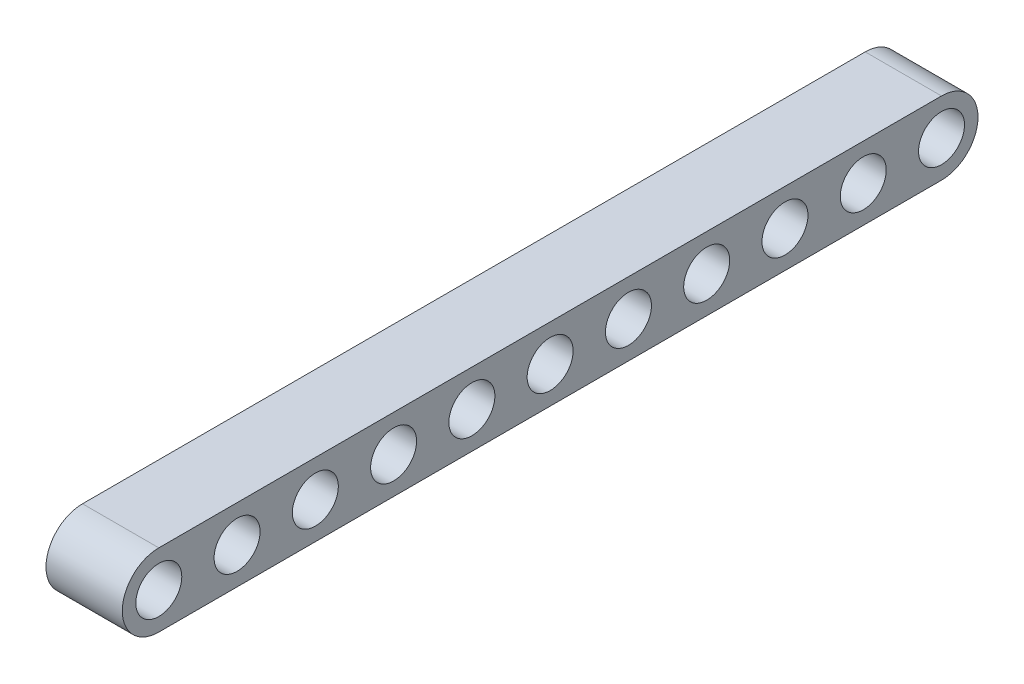
ISO-10303-21;
HEADER;
FILE_DESCRIPTION(('STEP AP214'),'2;1');
FILE_NAME('part.step','',(''),(''),'','','');
FILE_SCHEMA(('AUTOMOTIVE_DESIGN { 1 0 10303 214 1 1 1 1 }'));
ENDSEC;
DATA;
#1=APPLICATION_CONTEXT('core data for automotive mechanical design processes');
#2=APPLICATION_PROTOCOL_DEFINITION('international standard','automotive_design',2000,#1);
#3=PRODUCT_CONTEXT('',#1,'mechanical');
#4=PRODUCT('Part','Part','',(#3));
#5=PRODUCT_RELATED_PRODUCT_CATEGORY('part','',(#4));
#6=PRODUCT_DEFINITION_FORMATION('','',#4);
#7=PRODUCT_DEFINITION_CONTEXT('part definition',#1,'design');
#8=PRODUCT_DEFINITION('design','',#6,#7);
#9=PRODUCT_DEFINITION_SHAPE('','',#8);
#10=(LENGTH_UNIT() NAMED_UNIT(*) SI_UNIT(.MILLI.,.METRE.));
#11=(NAMED_UNIT(*) PLANE_ANGLE_UNIT() SI_UNIT($,.RADIAN.));
#12=(NAMED_UNIT(*) SI_UNIT($,.STERADIAN.) SOLID_ANGLE_UNIT());
#13=UNCERTAINTY_MEASURE_WITH_UNIT(LENGTH_MEASURE(1.E-05),#10,'distance_accuracy_value','');
#14=(GEOMETRIC_REPRESENTATION_CONTEXT(3) GLOBAL_UNCERTAINTY_ASSIGNED_CONTEXT((#13)) GLOBAL_UNIT_ASSIGNED_CONTEXT((#10,
#11,#12)) REPRESENTATION_CONTEXT('',''));
#15=CARTESIAN_POINT('',(0.,0.,0.));
#16=DIRECTION('',(0.,0.,1.));
#17=DIRECTION('',(1.,0.,0.));
#18=AXIS2_PLACEMENT_3D('',#15,#16,#17);
#19=CARTESIAN_POINT('',(7.8,0.,-40.));
#20=DIRECTION('',(1.,0.,0.));
#21=DIRECTION('',(0.,0.,-1.));
#22=AXIS2_PLACEMENT_3D('',#19,#20,#21);
#23=PLANE('',#22);
#24=CARTESIAN_POINT('',(7.8,0.,-32.));
#25=DIRECTION('',(1.,0.,0.));
#26=DIRECTION('',(0.,0.,-1.));
#27=AXIS2_PLACEMENT_3D('',#24,#25,#26);
#28=CIRCLE('',#27,2.35);
#29=CARTESIAN_POINT('',(7.8,0.,-34.35));
#30=VERTEX_POINT('',#29);
#31=EDGE_CURVE('E163',#30,#30,#28,.T.);
#32=ORIENTED_EDGE('',*,*,#31,.F.);
#33=EDGE_LOOP('',(#32));
#34=FACE_BOUND('',#33,.T.);
#35=CARTESIAN_POINT('',(7.8,0.,-16.));
#36=DIRECTION('',(1.,0.,0.));
#37=DIRECTION('',(0.,0.,-1.));
#38=AXIS2_PLACEMENT_3D('',#35,#36,#37);
#39=CIRCLE('',#38,2.35);
#40=CARTESIAN_POINT('',(7.8,0.,-18.35));
#41=VERTEX_POINT('',#40);
#42=EDGE_CURVE('E151',#41,#41,#39,.T.);
#43=ORIENTED_EDGE('',*,*,#42,.F.);
#44=EDGE_LOOP('',(#43));
#45=FACE_BOUND('',#44,.T.);
#46=CARTESIAN_POINT('',(7.8,0.,0.));
#47=DIRECTION('',(1.,0.,0.));
#48=DIRECTION('',(0.,0.,-1.));
#49=AXIS2_PLACEMENT_3D('',#46,#47,#48);
#50=CIRCLE('',#49,2.35);
#51=CARTESIAN_POINT('',(7.8,0.,-2.34999999999998));
#52=VERTEX_POINT('',#51);
#53=EDGE_CURVE('E139',#52,#52,#50,.T.);
#54=ORIENTED_EDGE('',*,*,#53,.F.);
#55=EDGE_LOOP('',(#54));
#56=FACE_BOUND('',#55,.T.);
#57=CARTESIAN_POINT('',(7.8,0.,16.));
#58=DIRECTION('',(1.,0.,0.));
#59=DIRECTION('',(0.,0.,-1.));
#60=AXIS2_PLACEMENT_3D('',#57,#58,#59);
#61=CIRCLE('',#60,2.35);
#62=CARTESIAN_POINT('',(7.8,0.,13.65));
#63=VERTEX_POINT('',#62);
#64=EDGE_CURVE('E127',#63,#63,#61,.T.);
#65=ORIENTED_EDGE('',*,*,#64,.F.);
#66=EDGE_LOOP('',(#65));
#67=FACE_BOUND('',#66,.T.);
#68=CARTESIAN_POINT('',(7.8,0.,32.));
#69=DIRECTION('',(1.,0.,0.));
#70=DIRECTION('',(0.,0.,-1.));
#71=AXIS2_PLACEMENT_3D('',#68,#69,#70);
#72=CIRCLE('',#71,2.35);
#73=CARTESIAN_POINT('',(7.8,0.,29.65));
#74=VERTEX_POINT('',#73);
#75=EDGE_CURVE('E115',#74,#74,#72,.T.);
#76=ORIENTED_EDGE('',*,*,#75,.F.);
#77=EDGE_LOOP('',(#76));
#78=FACE_BOUND('',#77,.T.);
#79=CARTESIAN_POINT('',(7.8,0.,-40.));
#80=DIRECTION('',(1.,0.,0.));
#81=DIRECTION('',(0.,0.,-1.));
#82=AXIS2_PLACEMENT_3D('',#79,#80,#81);
#83=CIRCLE('',#82,3.73);
#84=CARTESIAN_POINT('',(7.8,-3.73,-40.));
#85=VERTEX_POINT('',#84);
#86=CARTESIAN_POINT('',(7.8,3.73,-40.));
#87=VERTEX_POINT('',#86);
#88=EDGE_CURVE('E85',#85,#87,#83,.T.);
#89=ORIENTED_EDGE('',*,*,#88,.T.);
#90=DIRECTION('',(0.,0.,1.));
#91=VECTOR('',#90,1.);
#92=CARTESIAN_POINT('',(7.8,3.73,40.));
#93=LINE('',#92,#91);
#94=CARTESIAN_POINT('',(7.8,3.73,40.));
#95=VERTEX_POINT('',#94);
#96=EDGE_CURVE('E80',#87,#95,#93,.T.);
#97=ORIENTED_EDGE('',*,*,#96,.T.);
#98=CARTESIAN_POINT('',(7.8,0.,40.));
#99=DIRECTION('',(1.,0.,0.));
#100=DIRECTION('',(0.,0.,-1.));
#101=AXIS2_PLACEMENT_3D('',#98,#99,#100);
#102=CIRCLE('',#101,3.73);
#103=CARTESIAN_POINT('',(7.8,-3.73,40.));
#104=VERTEX_POINT('',#103);
#105=EDGE_CURVE('E83',#95,#104,#102,.T.);
#106=ORIENTED_EDGE('',*,*,#105,.T.);
#107=DIRECTION('',(0.,0.,-1.));
#108=VECTOR('',#107,1.);
#109=CARTESIAN_POINT('',(7.8,-3.73,40.));
#110=LINE('',#109,#108);
#111=EDGE_CURVE('E50',#104,#85,#110,.T.);
#112=ORIENTED_EDGE('',*,*,#111,.T.);
#113=EDGE_LOOP('',(#89,#97,#106,#112));
#114=FACE_BOUND('',#113,.T.);
#115=CARTESIAN_POINT('',(7.8,0.,40.));
#116=DIRECTION('',(1.,0.,0.));
#117=DIRECTION('',(0.,0.,-1.));
#118=AXIS2_PLACEMENT_3D('',#115,#116,#117);
#119=CIRCLE('',#118,2.35);
#120=CARTESIAN_POINT('',(7.8,0.,37.65));
#121=VERTEX_POINT('',#120);
#122=EDGE_CURVE('E100',#121,#121,#119,.T.);
#123=ORIENTED_EDGE('',*,*,#122,.F.);
#124=EDGE_LOOP('',(#123));
#125=FACE_BOUND('',#124,.T.);
#126=CARTESIAN_POINT('',(7.8,0.,24.));
#127=DIRECTION('',(1.,0.,0.));
#128=DIRECTION('',(0.,0.,-1.));
#129=AXIS2_PLACEMENT_3D('',#126,#127,#128);
#130=CIRCLE('',#129,2.35);
#131=CARTESIAN_POINT('',(7.8,0.,21.65));
#132=VERTEX_POINT('',#131);
#133=EDGE_CURVE('E121',#132,#132,#130,.T.);
#134=ORIENTED_EDGE('',*,*,#133,.F.);
#135=EDGE_LOOP('',(#134));
#136=FACE_BOUND('',#135,.T.);
#137=CARTESIAN_POINT('',(7.8,0.,8.00000000000001));
#138=DIRECTION('',(1.,0.,0.));
#139=DIRECTION('',(0.,0.,-1.));
#140=AXIS2_PLACEMENT_3D('',#137,#138,#139);
#141=CIRCLE('',#140,2.35);
#142=CARTESIAN_POINT('',(7.8,0.,5.65000000000002));
#143=VERTEX_POINT('',#142);
#144=EDGE_CURVE('E133',#143,#143,#141,.T.);
#145=ORIENTED_EDGE('',*,*,#144,.F.);
#146=EDGE_LOOP('',(#145));
#147=FACE_BOUND('',#146,.T.);
#148=CARTESIAN_POINT('',(7.8,0.,-7.99999999999999));
#149=DIRECTION('',(1.,0.,0.));
#150=DIRECTION('',(0.,0.,-1.));
#151=AXIS2_PLACEMENT_3D('',#148,#149,#150);
#152=CIRCLE('',#151,2.35);
#153=CARTESIAN_POINT('',(7.8,0.,-10.35));
#154=VERTEX_POINT('',#153);
#155=EDGE_CURVE('E145',#154,#154,#152,.T.);
#156=ORIENTED_EDGE('',*,*,#155,.F.);
#157=EDGE_LOOP('',(#156));
#158=FACE_BOUND('',#157,.T.);
#159=CARTESIAN_POINT('',(7.8,0.,-24.));
#160=DIRECTION('',(1.,0.,0.));
#161=DIRECTION('',(0.,0.,-1.));
#162=AXIS2_PLACEMENT_3D('',#159,#160,#161);
#163=CIRCLE('',#162,2.35);
#164=CARTESIAN_POINT('',(7.8,0.,-26.35));
#165=VERTEX_POINT('',#164);
#166=EDGE_CURVE('E157',#165,#165,#163,.T.);
#167=ORIENTED_EDGE('',*,*,#166,.F.);
#168=EDGE_LOOP('',(#167));
#169=FACE_BOUND('',#168,.T.);
#170=CARTESIAN_POINT('',(7.8,0.,-40.));
#171=DIRECTION('',(1.,0.,0.));
#172=DIRECTION('',(0.,0.,-1.));
#173=AXIS2_PLACEMENT_3D('',#170,#171,#172);
#174=CIRCLE('',#173,2.35);
#175=CARTESIAN_POINT('',(7.8,0.,-42.35));
#176=VERTEX_POINT('',#175);
#177=EDGE_CURVE('E169',#176,#176,#174,.T.);
#178=ORIENTED_EDGE('',*,*,#177,.F.);
#179=EDGE_LOOP('',(#178));
#180=FACE_BOUND('',#179,.T.);
#181=ADVANCED_FACE('F33',(#34,#45,#56,#67,#78,#114,#125,#136,#147,#158,#169,#180),#23,.T.);
#182=CARTESIAN_POINT('',(0.,0.,-40.));
#183=DIRECTION('',(1.,0.,0.));
#184=DIRECTION('',(0.,0.,-1.));
#185=AXIS2_PLACEMENT_3D('',#182,#183,#184);
#186=PLANE('',#185);
#187=CARTESIAN_POINT('',(0.,0.,-40.));
#188=DIRECTION('',(1.,0.,0.));
#189=DIRECTION('',(0.,0.,-1.));
#190=AXIS2_PLACEMENT_3D('',#187,#188,#189);
#191=CIRCLE('',#190,3.73);
#192=CARTESIAN_POINT('',(0.,-3.73,-40.));
#193=VERTEX_POINT('',#192);
#194=CARTESIAN_POINT('',(0.,3.73,-40.));
#195=VERTEX_POINT('',#194);
#196=EDGE_CURVE('E97',#193,#195,#191,.T.);
#197=ORIENTED_EDGE('',*,*,#196,.F.);
#198=DIRECTION('',(0.,0.,-1.));
#199=VECTOR('',#198,1.);
#200=CARTESIAN_POINT('',(0.,-3.73,40.));
#201=LINE('',#200,#199);
#202=CARTESIAN_POINT('',(0.,-3.73,40.));
#203=VERTEX_POINT('',#202);
#204=EDGE_CURVE('E73',#203,#193,#201,.T.);
#205=ORIENTED_EDGE('',*,*,#204,.F.);
#206=CARTESIAN_POINT('',(0.,0.,40.));
#207=DIRECTION('',(1.,0.,0.));
#208=DIRECTION('',(0.,0.,-1.));
#209=AXIS2_PLACEMENT_3D('',#206,#207,#208);
#210=CIRCLE('',#209,3.73);
#211=CARTESIAN_POINT('',(0.,3.73,40.));
#212=VERTEX_POINT('',#211);
#213=EDGE_CURVE('E67',#212,#203,#210,.T.);
#214=ORIENTED_EDGE('',*,*,#213,.F.);
#215=DIRECTION('',(0.,0.,1.));
#216=VECTOR('',#215,1.);
#217=CARTESIAN_POINT('',(0.,3.73,40.));
#218=LINE('',#217,#216);
#219=EDGE_CURVE('E89',#195,#212,#218,.T.);
#220=ORIENTED_EDGE('',*,*,#219,.F.);
#221=EDGE_LOOP('',(#197,#205,#214,#220));
#222=FACE_BOUND('',#221,.T.);
#223=CARTESIAN_POINT('',(0.,0.,40.));
#224=DIRECTION('',(1.,0.,0.));
#225=DIRECTION('',(0.,0.,-1.));
#226=AXIS2_PLACEMENT_3D('',#223,#224,#225);
#227=CIRCLE('',#226,2.35);
#228=CARTESIAN_POINT('',(0.,0.,37.65));
#229=VERTEX_POINT('',#228);
#230=EDGE_CURVE('E112',#229,#229,#227,.T.);
#231=ORIENTED_EDGE('',*,*,#230,.T.);
#232=EDGE_LOOP('',(#231));
#233=FACE_BOUND('',#232,.T.);
#234=CARTESIAN_POINT('',(0.,0.,32.));
#235=DIRECTION('',(1.,0.,0.));
#236=DIRECTION('',(0.,0.,-1.));
#237=AXIS2_PLACEMENT_3D('',#234,#235,#236);
#238=CIRCLE('',#237,2.35);
#239=CARTESIAN_POINT('',(0.,0.,29.65));
#240=VERTEX_POINT('',#239);
#241=EDGE_CURVE('E118',#240,#240,#238,.T.);
#242=ORIENTED_EDGE('',*,*,#241,.T.);
#243=EDGE_LOOP('',(#242));
#244=FACE_BOUND('',#243,.T.);
#245=CARTESIAN_POINT('',(0.,0.,24.));
#246=DIRECTION('',(1.,0.,0.));
#247=DIRECTION('',(0.,0.,-1.));
#248=AXIS2_PLACEMENT_3D('',#245,#246,#247);
#249=CIRCLE('',#248,2.35);
#250=CARTESIAN_POINT('',(0.,0.,21.65));
#251=VERTEX_POINT('',#250);
#252=EDGE_CURVE('E124',#251,#251,#249,.T.);
#253=ORIENTED_EDGE('',*,*,#252,.T.);
#254=EDGE_LOOP('',(#253));
#255=FACE_BOUND('',#254,.T.);
#256=CARTESIAN_POINT('',(0.,0.,16.));
#257=DIRECTION('',(1.,0.,0.));
#258=DIRECTION('',(0.,0.,-1.));
#259=AXIS2_PLACEMENT_3D('',#256,#257,#258);
#260=CIRCLE('',#259,2.35);
#261=CARTESIAN_POINT('',(0.,0.,13.65));
#262=VERTEX_POINT('',#261);
#263=EDGE_CURVE('E130',#262,#262,#260,.T.);
#264=ORIENTED_EDGE('',*,*,#263,.T.);
#265=EDGE_LOOP('',(#264));
#266=FACE_BOUND('',#265,.T.);
#267=CARTESIAN_POINT('',(0.,0.,8.00000000000001));
#268=DIRECTION('',(1.,0.,0.));
#269=DIRECTION('',(0.,0.,-1.));
#270=AXIS2_PLACEMENT_3D('',#267,#268,#269);
#271=CIRCLE('',#270,2.35);
#272=CARTESIAN_POINT('',(0.,0.,5.65000000000002));
#273=VERTEX_POINT('',#272);
#274=EDGE_CURVE('E136',#273,#273,#271,.T.);
#275=ORIENTED_EDGE('',*,*,#274,.T.);
#276=EDGE_LOOP('',(#275));
#277=FACE_BOUND('',#276,.T.);
#278=CARTESIAN_POINT('',(0.,0.,0.));
#279=DIRECTION('',(1.,0.,0.));
#280=DIRECTION('',(0.,0.,-1.));
#281=AXIS2_PLACEMENT_3D('',#278,#279,#280);
#282=CIRCLE('',#281,2.35);
#283=CARTESIAN_POINT('',(0.,0.,-2.34999999999998));
#284=VERTEX_POINT('',#283);
#285=EDGE_CURVE('E142',#284,#284,#282,.T.);
#286=ORIENTED_EDGE('',*,*,#285,.T.);
#287=EDGE_LOOP('',(#286));
#288=FACE_BOUND('',#287,.T.);
#289=CARTESIAN_POINT('',(0.,0.,-7.99999999999999));
#290=DIRECTION('',(1.,0.,0.));
#291=DIRECTION('',(0.,0.,-1.));
#292=AXIS2_PLACEMENT_3D('',#289,#290,#291);
#293=CIRCLE('',#292,2.35);
#294=CARTESIAN_POINT('',(0.,0.,-10.35));
#295=VERTEX_POINT('',#294);
#296=EDGE_CURVE('E148',#295,#295,#293,.T.);
#297=ORIENTED_EDGE('',*,*,#296,.T.);
#298=EDGE_LOOP('',(#297));
#299=FACE_BOUND('',#298,.T.);
#300=CARTESIAN_POINT('',(0.,0.,-16.));
#301=DIRECTION('',(1.,0.,0.));
#302=DIRECTION('',(0.,0.,-1.));
#303=AXIS2_PLACEMENT_3D('',#300,#301,#302);
#304=CIRCLE('',#303,2.35);
#305=CARTESIAN_POINT('',(0.,0.,-18.35));
#306=VERTEX_POINT('',#305);
#307=EDGE_CURVE('E154',#306,#306,#304,.T.);
#308=ORIENTED_EDGE('',*,*,#307,.T.);
#309=EDGE_LOOP('',(#308));
#310=FACE_BOUND('',#309,.T.);
#311=CARTESIAN_POINT('',(0.,0.,-24.));
#312=DIRECTION('',(1.,0.,0.));
#313=DIRECTION('',(0.,0.,-1.));
#314=AXIS2_PLACEMENT_3D('',#311,#312,#313);
#315=CIRCLE('',#314,2.35);
#316=CARTESIAN_POINT('',(0.,0.,-26.35));
#317=VERTEX_POINT('',#316);
#318=EDGE_CURVE('E160',#317,#317,#315,.T.);
#319=ORIENTED_EDGE('',*,*,#318,.T.);
#320=EDGE_LOOP('',(#319));
#321=FACE_BOUND('',#320,.T.);
#322=CARTESIAN_POINT('',(0.,0.,-32.));
#323=DIRECTION('',(1.,0.,0.));
#324=DIRECTION('',(0.,0.,-1.));
#325=AXIS2_PLACEMENT_3D('',#322,#323,#324);
#326=CIRCLE('',#325,2.35);
#327=CARTESIAN_POINT('',(0.,0.,-34.35));
#328=VERTEX_POINT('',#327);
#329=EDGE_CURVE('E166',#328,#328,#326,.T.);
#330=ORIENTED_EDGE('',*,*,#329,.T.);
#331=EDGE_LOOP('',(#330));
#332=FACE_BOUND('',#331,.T.);
#333=CARTESIAN_POINT('',(0.,0.,-40.));
#334=DIRECTION('',(1.,0.,0.));
#335=DIRECTION('',(0.,0.,-1.));
#336=AXIS2_PLACEMENT_3D('',#333,#334,#335);
#337=CIRCLE('',#336,2.35);
#338=CARTESIAN_POINT('',(0.,0.,-42.35));
#339=VERTEX_POINT('',#338);
#340=EDGE_CURVE('E172',#339,#339,#337,.T.);
#341=ORIENTED_EDGE('',*,*,#340,.T.);
#342=EDGE_LOOP('',(#341));
#343=FACE_BOUND('',#342,.T.);
#344=ADVANCED_FACE('F108',(#222,#233,#244,#255,#266,#277,#288,#299,#310,#321,#332,#343),#186,.F.);
#345=CARTESIAN_POINT('',(7.8,0.,-40.));
#346=DIRECTION('',(-1.,0.,0.));
#347=DIRECTION('',(0.,0.,1.));
#348=AXIS2_PLACEMENT_3D('',#345,#346,#347);
#349=CYLINDRICAL_SURFACE('',#348,3.73);
#350=ORIENTED_EDGE('',*,*,#196,.T.);
#351=DIRECTION('',(-1.,0.,0.));
#352=VECTOR('',#351,1.);
#353=CARTESIAN_POINT('',(7.8,3.73,-40.));
#354=LINE('',#353,#352);
#355=EDGE_CURVE('E11',#87,#195,#354,.T.);
#356=ORIENTED_EDGE('',*,*,#355,.F.);
#357=ORIENTED_EDGE('',*,*,#88,.F.);
#358=DIRECTION('',(-1.,0.,0.));
#359=VECTOR('',#358,1.);
#360=CARTESIAN_POINT('',(7.8,-3.73,-40.));
#361=LINE('',#360,#359);
#362=EDGE_CURVE('E93',#85,#193,#361,.T.);
#363=ORIENTED_EDGE('',*,*,#362,.T.);
#364=EDGE_LOOP('',(#350,#356,#357,#363));
#365=FACE_BOUND('',#364,.T.);
#366=ADVANCED_FACE('F35',(#365),#349,.T.);
#367=CARTESIAN_POINT('',(7.8,3.73,40.));
#368=DIRECTION('',(0.,-1.,0.));
#369=DIRECTION('',(0.,0.,-1.));
#370=AXIS2_PLACEMENT_3D('',#367,#368,#369);
#371=PLANE('',#370);
#372=ORIENTED_EDGE('',*,*,#219,.T.);
#373=DIRECTION('',(-1.,0.,0.));
#374=VECTOR('',#373,1.);
#375=CARTESIAN_POINT('',(7.8,3.73,40.));
#376=LINE('',#375,#374);
#377=EDGE_CURVE('E42',#95,#212,#376,.T.);
#378=ORIENTED_EDGE('',*,*,#377,.F.);
#379=ORIENTED_EDGE('',*,*,#96,.F.);
#380=ORIENTED_EDGE('',*,*,#355,.T.);
#381=EDGE_LOOP('',(#372,#378,#379,#380));
#382=FACE_BOUND('',#381,.T.);
#383=ADVANCED_FACE('F88',(#382),#371,.F.);
#384=CARTESIAN_POINT('',(7.8,0.,40.));
#385=DIRECTION('',(-1.,0.,0.));
#386=DIRECTION('',(0.,0.,1.));
#387=AXIS2_PLACEMENT_3D('',#384,#385,#386);
#388=CYLINDRICAL_SURFACE('',#387,3.73);
#389=ORIENTED_EDGE('',*,*,#213,.T.);
#390=DIRECTION('',(-1.,0.,0.));
#391=VECTOR('',#390,1.);
#392=CARTESIAN_POINT('',(7.8,-3.73,40.));
#393=LINE('',#392,#391);
#394=EDGE_CURVE('E90',#104,#203,#393,.T.);
#395=ORIENTED_EDGE('',*,*,#394,.F.);
#396=ORIENTED_EDGE('',*,*,#105,.F.);
#397=ORIENTED_EDGE('',*,*,#377,.T.);
#398=EDGE_LOOP('',(#389,#395,#396,#397));
#399=FACE_BOUND('',#398,.T.);
#400=ADVANCED_FACE('F91',(#399),#388,.T.);
#401=CARTESIAN_POINT('',(7.8,-3.73,40.));
#402=DIRECTION('',(0.,1.,0.));
#403=DIRECTION('',(0.,0.,1.));
#404=AXIS2_PLACEMENT_3D('',#401,#402,#403);
#405=PLANE('',#404);
#406=ORIENTED_EDGE('',*,*,#204,.T.);
#407=ORIENTED_EDGE('',*,*,#362,.F.);
#408=ORIENTED_EDGE('',*,*,#111,.F.);
#409=ORIENTED_EDGE('',*,*,#394,.T.);
#410=EDGE_LOOP('',(#406,#407,#408,#409));
#411=FACE_BOUND('',#410,.T.);
#412=ADVANCED_FACE('F105',(#411),#405,.F.);
#413=CARTESIAN_POINT('',(7.8,0.,40.));
#414=DIRECTION('',(-1.,0.,0.));
#415=DIRECTION('',(0.,0.,1.));
#416=AXIS2_PLACEMENT_3D('',#413,#414,#415);
#417=CYLINDRICAL_SURFACE('',#416,2.35);
#418=ORIENTED_EDGE('',*,*,#122,.T.);
#419=EDGE_LOOP('',(#418));
#420=FACE_BOUND('',#419,.T.);
#421=ORIENTED_EDGE('',*,*,#230,.F.);
#422=EDGE_LOOP('',(#421));
#423=FACE_BOUND('',#422,.T.);
#424=ADVANCED_FACE('F191',(#420,#423),#417,.F.);
#425=CARTESIAN_POINT('',(7.8,0.,32.));
#426=DIRECTION('',(-1.,0.,0.));
#427=DIRECTION('',(0.,0.,1.));
#428=AXIS2_PLACEMENT_3D('',#425,#426,#427);
#429=CYLINDRICAL_SURFACE('',#428,2.35);
#430=ORIENTED_EDGE('',*,*,#75,.T.);
#431=EDGE_LOOP('',(#430));
#432=FACE_BOUND('',#431,.T.);
#433=ORIENTED_EDGE('',*,*,#241,.F.);
#434=EDGE_LOOP('',(#433));
#435=FACE_BOUND('',#434,.T.);
#436=ADVANCED_FACE('F237',(#432,#435),#429,.F.);
#437=CARTESIAN_POINT('',(7.8,0.,24.));
#438=DIRECTION('',(-1.,0.,0.));
#439=DIRECTION('',(0.,0.,1.));
#440=AXIS2_PLACEMENT_3D('',#437,#438,#439);
#441=CYLINDRICAL_SURFACE('',#440,2.35);
#442=ORIENTED_EDGE('',*,*,#133,.T.);
#443=EDGE_LOOP('',(#442));
#444=FACE_BOUND('',#443,.T.);
#445=ORIENTED_EDGE('',*,*,#252,.F.);
#446=EDGE_LOOP('',(#445));
#447=FACE_BOUND('',#446,.T.);
#448=ADVANCED_FACE('F245',(#444,#447),#441,.F.);
#449=CARTESIAN_POINT('',(7.8,0.,16.));
#450=DIRECTION('',(-1.,0.,0.));
#451=DIRECTION('',(0.,0.,1.));
#452=AXIS2_PLACEMENT_3D('',#449,#450,#451);
#453=CYLINDRICAL_SURFACE('',#452,2.35);
#454=ORIENTED_EDGE('',*,*,#64,.T.);
#455=EDGE_LOOP('',(#454));
#456=FACE_BOUND('',#455,.T.);
#457=ORIENTED_EDGE('',*,*,#263,.F.);
#458=EDGE_LOOP('',(#457));
#459=FACE_BOUND('',#458,.T.);
#460=ADVANCED_FACE('F253',(#456,#459),#453,.F.);
#461=CARTESIAN_POINT('',(7.8,0.,8.00000000000001));
#462=DIRECTION('',(-1.,0.,0.));
#463=DIRECTION('',(0.,0.,1.));
#464=AXIS2_PLACEMENT_3D('',#461,#462,#463);
#465=CYLINDRICAL_SURFACE('',#464,2.35);
#466=ORIENTED_EDGE('',*,*,#144,.T.);
#467=EDGE_LOOP('',(#466));
#468=FACE_BOUND('',#467,.T.);
#469=ORIENTED_EDGE('',*,*,#274,.F.);
#470=EDGE_LOOP('',(#469));
#471=FACE_BOUND('',#470,.T.);
#472=ADVANCED_FACE('F262',(#468,#471),#465,.F.);
#473=CARTESIAN_POINT('',(7.8,0.,0.));
#474=DIRECTION('',(-1.,0.,0.));
#475=DIRECTION('',(0.,0.,1.));
#476=AXIS2_PLACEMENT_3D('',#473,#474,#475);
#477=CYLINDRICAL_SURFACE('',#476,2.35);
#478=ORIENTED_EDGE('',*,*,#53,.T.);
#479=EDGE_LOOP('',(#478));
#480=FACE_BOUND('',#479,.T.);
#481=ORIENTED_EDGE('',*,*,#285,.F.);
#482=EDGE_LOOP('',(#481));
#483=FACE_BOUND('',#482,.T.);
#484=ADVANCED_FACE('F271',(#480,#483),#477,.F.);
#485=CARTESIAN_POINT('',(7.8,0.,-7.99999999999999));
#486=DIRECTION('',(-1.,0.,0.));
#487=DIRECTION('',(0.,0.,1.));
#488=AXIS2_PLACEMENT_3D('',#485,#486,#487);
#489=CYLINDRICAL_SURFACE('',#488,2.35);
#490=ORIENTED_EDGE('',*,*,#155,.T.);
#491=EDGE_LOOP('',(#490));
#492=FACE_BOUND('',#491,.T.);
#493=ORIENTED_EDGE('',*,*,#296,.F.);
#494=EDGE_LOOP('',(#493));
#495=FACE_BOUND('',#494,.T.);
#496=ADVANCED_FACE('F280',(#492,#495),#489,.F.);
#497=CARTESIAN_POINT('',(7.8,0.,-16.));
#498=DIRECTION('',(-1.,0.,0.));
#499=DIRECTION('',(0.,0.,1.));
#500=AXIS2_PLACEMENT_3D('',#497,#498,#499);
#501=CYLINDRICAL_SURFACE('',#500,2.35);
#502=ORIENTED_EDGE('',*,*,#42,.T.);
#503=EDGE_LOOP('',(#502));
#504=FACE_BOUND('',#503,.T.);
#505=ORIENTED_EDGE('',*,*,#307,.F.);
#506=EDGE_LOOP('',(#505));
#507=FACE_BOUND('',#506,.T.);
#508=ADVANCED_FACE('F289',(#504,#507),#501,.F.);
#509=CARTESIAN_POINT('',(7.8,0.,-24.));
#510=DIRECTION('',(-1.,0.,0.));
#511=DIRECTION('',(0.,0.,1.));
#512=AXIS2_PLACEMENT_3D('',#509,#510,#511);
#513=CYLINDRICAL_SURFACE('',#512,2.35);
#514=ORIENTED_EDGE('',*,*,#166,.T.);
#515=EDGE_LOOP('',(#514));
#516=FACE_BOUND('',#515,.T.);
#517=ORIENTED_EDGE('',*,*,#318,.F.);
#518=EDGE_LOOP('',(#517));
#519=FACE_BOUND('',#518,.T.);
#520=ADVANCED_FACE('F298',(#516,#519),#513,.F.);
#521=CARTESIAN_POINT('',(7.8,0.,-32.));
#522=DIRECTION('',(-1.,0.,0.));
#523=DIRECTION('',(0.,0.,1.));
#524=AXIS2_PLACEMENT_3D('',#521,#522,#523);
#525=CYLINDRICAL_SURFACE('',#524,2.35);
#526=ORIENTED_EDGE('',*,*,#31,.T.);
#527=EDGE_LOOP('',(#526));
#528=FACE_BOUND('',#527,.T.);
#529=ORIENTED_EDGE('',*,*,#329,.F.);
#530=EDGE_LOOP('',(#529));
#531=FACE_BOUND('',#530,.T.);
#532=ADVANCED_FACE('F307',(#528,#531),#525,.F.);
#533=CARTESIAN_POINT('',(7.8,0.,-40.));
#534=DIRECTION('',(-1.,0.,0.));
#535=DIRECTION('',(0.,0.,1.));
#536=AXIS2_PLACEMENT_3D('',#533,#534,#535);
#537=CYLINDRICAL_SURFACE('',#536,2.35);
#538=ORIENTED_EDGE('',*,*,#177,.T.);
#539=EDGE_LOOP('',(#538));
#540=FACE_BOUND('',#539,.T.);
#541=ORIENTED_EDGE('',*,*,#340,.F.);
#542=EDGE_LOOP('',(#541));
#543=FACE_BOUND('',#542,.T.);
#544=ADVANCED_FACE('F178',(#540,#543),#537,.F.);
#545=CLOSED_SHELL('',(#181,#344,#366,#383,#400,#412,#424,#436,#448,#460,#472,#484,#496,#508,
#520,#532,#544));
#546=MANIFOLD_SOLID_BREP('B2',#545);
#547=ADVANCED_BREP_SHAPE_REPRESENTATION('',(#18,#546),#14);
#548=SHAPE_DEFINITION_REPRESENTATION(#9,#547);
ENDSEC;
END-ISO-10303-21;
